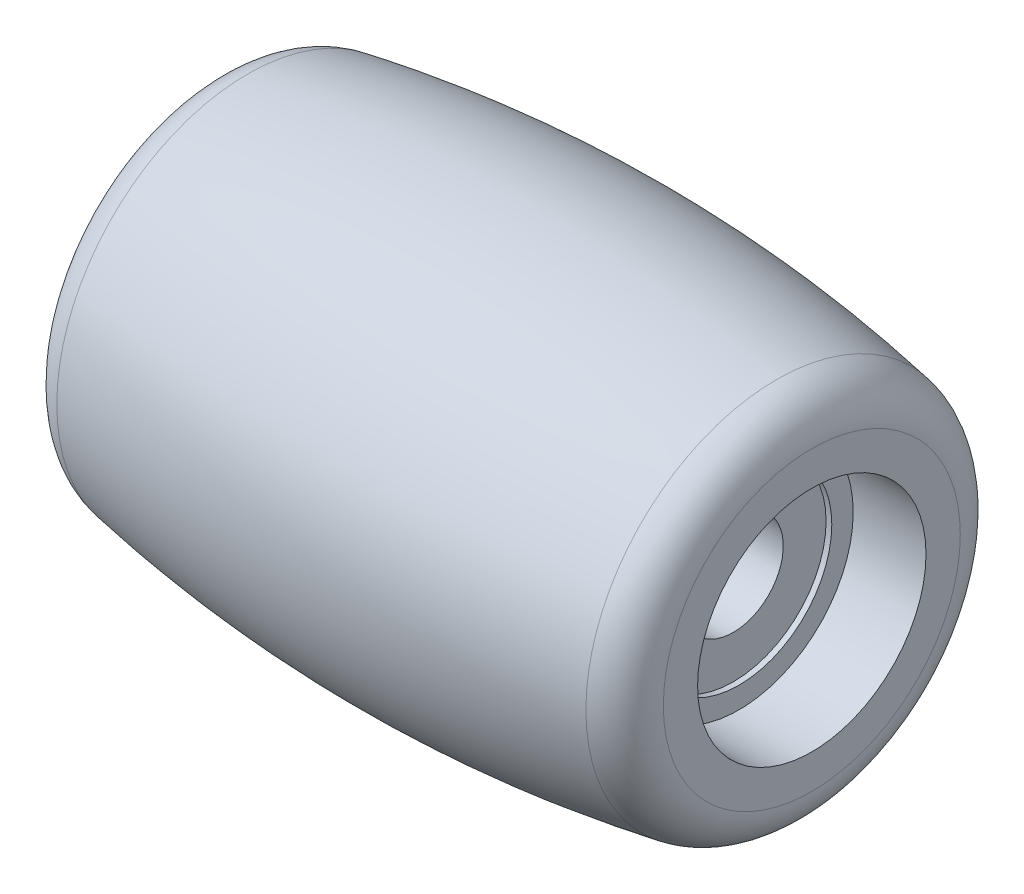
ISO-10303-21;
HEADER;
FILE_DESCRIPTION(('STEP AP214'),'2;1');
FILE_NAME('part.step','',(''),(''),'','','');
FILE_SCHEMA(('AUTOMOTIVE_DESIGN { 1 0 10303 214 1 1 1 1 }'));
ENDSEC;
DATA;
#1=APPLICATION_CONTEXT('core data for automotive mechanical design processes');
#2=APPLICATION_PROTOCOL_DEFINITION('international standard','automotive_design',2000,#1);
#3=PRODUCT_CONTEXT('',#1,'mechanical');
#4=PRODUCT('Part','Part','',(#3));
#5=PRODUCT_RELATED_PRODUCT_CATEGORY('part','',(#4));
#6=PRODUCT_DEFINITION_FORMATION('','',#4);
#7=PRODUCT_DEFINITION_CONTEXT('part definition',#1,'design');
#8=PRODUCT_DEFINITION('design','',#6,#7);
#9=PRODUCT_DEFINITION_SHAPE('','',#8);
#10=(LENGTH_UNIT() NAMED_UNIT(*) SI_UNIT(.MILLI.,.METRE.));
#11=(NAMED_UNIT(*) PLANE_ANGLE_UNIT() SI_UNIT($,.RADIAN.));
#12=(NAMED_UNIT(*) SI_UNIT($,.STERADIAN.) SOLID_ANGLE_UNIT());
#13=UNCERTAINTY_MEASURE_WITH_UNIT(LENGTH_MEASURE(1.E-05),#10,'distance_accuracy_value','');
#14=(GEOMETRIC_REPRESENTATION_CONTEXT(3) GLOBAL_UNCERTAINTY_ASSIGNED_CONTEXT((#13)) GLOBAL_UNIT_ASSIGNED_CONTEXT((#10,
#11,#12)) REPRESENTATION_CONTEXT('',''));
#15=CARTESIAN_POINT('',(0.,0.,0.));
#16=DIRECTION('',(0.,0.,1.));
#17=DIRECTION('',(1.,0.,0.));
#18=AXIS2_PLACEMENT_3D('',#15,#16,#17);
#19=CARTESIAN_POINT('',(15.5,48.5,0.));
#20=DIRECTION('',(-1.,0.,0.));
#21=DIRECTION('',(0.,0.,1.));
#22=AXIS2_PLACEMENT_3D('',#19,#20,#21);
#23=CYLINDRICAL_SURFACE('',#22,3.5);
#24=CARTESIAN_POINT('',(15.5,48.5,0.));
#25=DIRECTION('',(-1.,0.,0.));
#26=DIRECTION('',(0.,0.,1.));
#27=AXIS2_PLACEMENT_3D('',#24,#25,#26);
#28=CIRCLE('',#27,3.5);
#29=CARTESIAN_POINT('',(15.5,48.5,3.5));
#30=VERTEX_POINT('',#29);
#31=EDGE_CURVE('E297',#30,#30,#28,.F.);
#32=ORIENTED_EDGE('',*,*,#31,.T.);
#33=EDGE_LOOP('',(#32));
#34=FACE_BOUND('',#33,.T.);
#35=CARTESIAN_POINT('',(-15.5,48.5,0.));
#36=DIRECTION('',(-1.,0.,0.));
#37=DIRECTION('',(0.,0.,1.));
#38=AXIS2_PLACEMENT_3D('',#35,#36,#37);
#39=CIRCLE('',#38,3.5);
#40=CARTESIAN_POINT('',(-15.5,48.5,3.5));
#41=VERTEX_POINT('',#40);
#42=EDGE_CURVE('E294',#41,#41,#39,.T.);
#43=ORIENTED_EDGE('',*,*,#42,.T.);
#44=EDGE_LOOP('',(#43));
#45=FACE_BOUND('',#44,.T.);
#46=ADVANCED_FACE('F16',(#34,#45),#23,.F.);
#47=CARTESIAN_POINT('',(15.5,41.922,-6.578));
#48=DIRECTION('',(-1.,0.,0.));
#49=DIRECTION('',(0.,0.,1.));
#50=AXIS2_PLACEMENT_3D('',#47,#48,#49);
#51=PLANE('',#50);
#52=CARTESIAN_POINT('',(15.5,48.5,0.));
#53=DIRECTION('',(-1.,0.,0.));
#54=DIRECTION('',(0.,0.,1.));
#55=AXIS2_PLACEMENT_3D('',#52,#53,#54);
#56=CIRCLE('',#55,6.5);
#57=CARTESIAN_POINT('',(15.5,48.5,6.5));
#58=VERTEX_POINT('',#57);
#59=EDGE_CURVE('E292',#58,#58,#56,.F.);
#60=ORIENTED_EDGE('',*,*,#59,.T.);
#61=EDGE_LOOP('',(#60));
#62=FACE_BOUND('',#61,.T.);
#63=ORIENTED_EDGE('',*,*,#31,.F.);
#64=EDGE_LOOP('',(#63));
#65=FACE_BOUND('',#64,.T.);
#66=ADVANCED_FACE('F151',(#62,#65),#51,.F.);
#67=CARTESIAN_POINT('',(-15.5,41.922,6.578));
#68=DIRECTION('',(1.,0.,0.));
#69=DIRECTION('',(0.,0.,-1.));
#70=AXIS2_PLACEMENT_3D('',#67,#68,#69);
#71=PLANE('',#70);
#72=CARTESIAN_POINT('',(-15.5,48.5,0.));
#73=DIRECTION('',(-1.,0.,0.));
#74=DIRECTION('',(0.,0.,1.));
#75=AXIS2_PLACEMENT_3D('',#72,#73,#74);
#76=CIRCLE('',#75,6.5);
#77=CARTESIAN_POINT('',(-15.5,48.5,6.5));
#78=VERTEX_POINT('',#77);
#79=EDGE_CURVE('E289',#78,#78,#76,.T.);
#80=ORIENTED_EDGE('',*,*,#79,.T.);
#81=EDGE_LOOP('',(#80));
#82=FACE_BOUND('',#81,.T.);
#83=ORIENTED_EDGE('',*,*,#42,.F.);
#84=EDGE_LOOP('',(#83));
#85=FACE_BOUND('',#84,.T.);
#86=ADVANCED_FACE('F148',(#82,#85),#71,.F.);
#87=CARTESIAN_POINT('',(15.9,48.5,0.));
#88=DIRECTION('',(-1.,0.,0.));
#89=DIRECTION('',(0.,0.,1.));
#90=AXIS2_PLACEMENT_3D('',#87,#88,#89);
#91=CYLINDRICAL_SURFACE('',#90,6.5);
#92=ORIENTED_EDGE('',*,*,#59,.F.);
#93=EDGE_LOOP('',(#92));
#94=FACE_BOUND('',#93,.T.);
#95=CARTESIAN_POINT('',(15.9,48.5,0.));
#96=DIRECTION('',(-1.,0.,0.));
#97=DIRECTION('',(0.,0.,1.));
#98=AXIS2_PLACEMENT_3D('',#95,#96,#97);
#99=CIRCLE('',#98,6.5);
#100=CARTESIAN_POINT('',(15.9,48.5,6.5));
#101=VERTEX_POINT('',#100);
#102=EDGE_CURVE('E286',#101,#101,#99,.F.);
#103=ORIENTED_EDGE('',*,*,#102,.T.);
#104=EDGE_LOOP('',(#103));
#105=FACE_BOUND('',#104,.T.);
#106=ADVANCED_FACE('F144',(#94,#105),#91,.F.);
#107=CARTESIAN_POINT('',(-15.5,48.5,0.));
#108=DIRECTION('',(-1.,0.,0.));
#109=DIRECTION('',(0.,0.,1.));
#110=AXIS2_PLACEMENT_3D('',#107,#108,#109);
#111=CYLINDRICAL_SURFACE('',#110,6.5);
#112=ORIENTED_EDGE('',*,*,#79,.F.);
#113=EDGE_LOOP('',(#112));
#114=FACE_BOUND('',#113,.T.);
#115=CARTESIAN_POINT('',(-15.9,48.5,0.));
#116=DIRECTION('',(-1.,0.,0.));
#117=DIRECTION('',(0.,0.,1.));
#118=AXIS2_PLACEMENT_3D('',#115,#116,#117);
#119=CIRCLE('',#118,6.5);
#120=CARTESIAN_POINT('',(-15.9,48.5,6.5));
#121=VERTEX_POINT('',#120);
#122=EDGE_CURVE('E283',#121,#121,#119,.T.);
#123=ORIENTED_EDGE('',*,*,#122,.T.);
#124=EDGE_LOOP('',(#123));
#125=FACE_BOUND('',#124,.T.);
#126=ADVANCED_FACE('F140',(#114,#125),#111,.F.);
#127=CARTESIAN_POINT('',(15.9,40.404,-8.096));
#128=DIRECTION('',(-1.,0.,0.));
#129=DIRECTION('',(0.,0.,1.));
#130=AXIS2_PLACEMENT_3D('',#127,#128,#129);
#131=PLANE('',#130);
#132=CARTESIAN_POINT('',(15.9,48.5,0.));
#133=DIRECTION('',(-1.,0.,0.));
#134=DIRECTION('',(0.,0.,1.));
#135=AXIS2_PLACEMENT_3D('',#132,#133,#134);
#136=CIRCLE('',#135,8.);
#137=CARTESIAN_POINT('',(15.9,48.5,8.));
#138=VERTEX_POINT('',#137);
#139=EDGE_CURVE('E278',#138,#138,#136,.F.);
#140=ORIENTED_EDGE('',*,*,#139,.T.);
#141=EDGE_LOOP('',(#140));
#142=FACE_BOUND('',#141,.T.);
#143=ORIENTED_EDGE('',*,*,#102,.F.);
#144=EDGE_LOOP('',(#143));
#145=FACE_BOUND('',#144,.T.);
#146=ADVANCED_FACE('F136',(#142,#145),#131,.F.);
#147=CARTESIAN_POINT('',(-15.9,40.404,8.096));
#148=DIRECTION('',(1.,0.,0.));
#149=DIRECTION('',(0.,0.,-1.));
#150=AXIS2_PLACEMENT_3D('',#147,#148,#149);
#151=PLANE('',#150);
#152=CARTESIAN_POINT('',(-15.9,48.5,0.));
#153=DIRECTION('',(-1.,0.,0.));
#154=DIRECTION('',(0.,0.,1.));
#155=AXIS2_PLACEMENT_3D('',#152,#153,#154);
#156=CIRCLE('',#155,8.);
#157=CARTESIAN_POINT('',(-15.9,48.5,8.));
#158=VERTEX_POINT('',#157);
#159=EDGE_CURVE('E274',#158,#158,#156,.T.);
#160=ORIENTED_EDGE('',*,*,#159,.T.);
#161=EDGE_LOOP('',(#160));
#162=FACE_BOUND('',#161,.T.);
#163=ORIENTED_EDGE('',*,*,#122,.F.);
#164=EDGE_LOOP('',(#163));
#165=FACE_BOUND('',#164,.T.);
#166=ADVANCED_FACE('F132',(#162,#165),#151,.F.);
#167=CARTESIAN_POINT('',(21.,48.5,0.));
#168=DIRECTION('',(-1.,0.,0.));
#169=DIRECTION('',(0.,0.,1.));
#170=AXIS2_PLACEMENT_3D('',#167,#168,#169);
#171=CYLINDRICAL_SURFACE('',#170,8.);
#172=ORIENTED_EDGE('',*,*,#139,.F.);
#173=EDGE_LOOP('',(#172));
#174=FACE_BOUND('',#173,.T.);
#175=CARTESIAN_POINT('',(21.,48.5,0.));
#176=DIRECTION('',(-1.,0.,0.));
#177=DIRECTION('',(0.,0.,1.));
#178=AXIS2_PLACEMENT_3D('',#175,#176,#177);
#179=CIRCLE('',#178,8.);
#180=CARTESIAN_POINT('',(21.,48.5,8.));
#181=VERTEX_POINT('',#180);
#182=EDGE_CURVE('E272',#181,#181,#179,.F.);
#183=ORIENTED_EDGE('',*,*,#182,.T.);
#184=EDGE_LOOP('',(#183));
#185=FACE_BOUND('',#184,.T.);
#186=ADVANCED_FACE('F128',(#174,#185),#171,.F.);
#187=CARTESIAN_POINT('',(-15.9,48.5,0.));
#188=DIRECTION('',(-1.,0.,0.));
#189=DIRECTION('',(0.,0.,1.));
#190=AXIS2_PLACEMENT_3D('',#187,#188,#189);
#191=CYLINDRICAL_SURFACE('',#190,8.);
#192=ORIENTED_EDGE('',*,*,#159,.F.);
#193=EDGE_LOOP('',(#192));
#194=FACE_BOUND('',#193,.T.);
#195=CARTESIAN_POINT('',(-21.,48.5,0.));
#196=DIRECTION('',(-1.,0.,0.));
#197=DIRECTION('',(0.,0.,1.));
#198=AXIS2_PLACEMENT_3D('',#195,#196,#197);
#199=CIRCLE('',#198,8.);
#200=CARTESIAN_POINT('',(-21.,48.5,8.));
#201=VERTEX_POINT('',#200);
#202=EDGE_CURVE('E51',#201,#201,#199,.T.);
#203=ORIENTED_EDGE('',*,*,#202,.T.);
#204=EDGE_LOOP('',(#203));
#205=FACE_BOUND('',#204,.T.);
#206=ADVANCED_FACE('F123',(#194,#205),#191,.F.);
#207=CARTESIAN_POINT('',(21.,37.295757622,-11.204242378));
#208=DIRECTION('',(-1.,0.,0.));
#209=DIRECTION('',(0.,0.,1.));
#210=AXIS2_PLACEMENT_3D('',#207,#208,#209);
#211=PLANE('',#210);
#212=ORIENTED_EDGE('',*,*,#182,.F.);
#213=EDGE_LOOP('',(#212));
#214=FACE_BOUND('',#213,.T.);
#215=CARTESIAN_POINT('',(21.,48.5,0.));
#216=DIRECTION('',(-1.,0.,0.));
#217=DIRECTION('',(0.,0.,1.));
#218=AXIS2_PLACEMENT_3D('',#215,#216,#217);
#219=CIRCLE('',#218,10.4003549674537);
#220=CARTESIAN_POINT('',(21.,48.5,10.4003549674537));
#221=VERTEX_POINT('',#220);
#222=CARTESIAN_POINT('',(21.,48.5,-10.4003549674537));
#223=VERTEX_POINT('',#222);
#224=EDGE_CURVE('E44',#221,#223,#219,.T.);
#225=ORIENTED_EDGE('',*,*,#224,.F.);
#226=CARTESIAN_POINT('',(21.,48.5,0.));
#227=DIRECTION('',(-1.,0.,0.));
#228=DIRECTION('',(0.,0.,-1.));
#229=AXIS2_PLACEMENT_3D('',#226,#227,#228);
#230=CIRCLE('',#229,10.4003549674537);
#231=EDGE_CURVE('E47',#223,#221,#230,.T.);
#232=ORIENTED_EDGE('',*,*,#231,.F.);
#233=EDGE_LOOP('',(#225,#232));
#234=FACE_BOUND('',#233,.T.);
#235=ADVANCED_FACE('F49',(#214,#234),#211,.F.);
#236=CARTESIAN_POINT('',(-21.,37.295757622,11.204242378));
#237=DIRECTION('',(1.,0.,0.));
#238=DIRECTION('',(0.,0.,-1.));
#239=AXIS2_PLACEMENT_3D('',#236,#237,#238);
#240=PLANE('',#239);
#241=ORIENTED_EDGE('',*,*,#202,.F.);
#242=EDGE_LOOP('',(#241));
#243=FACE_BOUND('',#242,.T.);
#244=CARTESIAN_POINT('',(-21.,48.5,0.));
#245=DIRECTION('',(1.,0.,0.));
#246=DIRECTION('',(0.,0.,-1.));
#247=AXIS2_PLACEMENT_3D('',#244,#245,#246);
#248=CIRCLE('',#247,10.4003549674537);
#249=CARTESIAN_POINT('',(-21.,48.5,-10.4003549674537));
#250=VERTEX_POINT('',#249);
#251=CARTESIAN_POINT('',(-21.,48.5,10.4003549674537));
#252=VERTEX_POINT('',#251);
#253=EDGE_CURVE('E56',#250,#252,#248,.T.);
#254=ORIENTED_EDGE('',*,*,#253,.F.);
#255=CARTESIAN_POINT('',(-21.,48.5,0.));
#256=DIRECTION('',(1.,0.,0.));
#257=DIRECTION('',(0.,0.,1.));
#258=AXIS2_PLACEMENT_3D('',#255,#256,#257);
#259=CIRCLE('',#258,10.4003549674537);
#260=EDGE_CURVE('E35',#252,#250,#259,.T.);
#261=ORIENTED_EDGE('',*,*,#260,.F.);
#262=EDGE_LOOP('',(#254,#261));
#263=FACE_BOUND('',#262,.T.);
#264=ADVANCED_FACE('F76',(#243,#263),#240,.F.);
#265=CARTESIAN_POINT('',(18.,48.5,0.));
#266=DIRECTION('',(-1.,0.,0.));
#267=DIRECTION('',(0.,0.,1.));
#268=AXIS2_PLACEMENT_3D('',#265,#266,#267);
#269=TOROIDAL_SURFACE('',#268,10.4003549674537,3.);
#270=CARTESIAN_POINT('',(18.5290368213527,48.5,0.));
#271=DIRECTION('',(-1.,0.,0.));
#272=DIRECTION('',(0.,0.,1.));
#273=AXIS2_PLACEMENT_3D('',#270,#271,#272);
#274=CIRCLE('',#273,13.3533399050471);
#275=CARTESIAN_POINT('',(18.5290368213527,48.5,13.3533399050471));
#276=VERTEX_POINT('',#275);
#277=EDGE_CURVE('E27',#276,#276,#274,.T.);
#278=ORIENTED_EDGE('',*,*,#277,.F.);
#279=EDGE_LOOP('',(#278));
#280=FACE_BOUND('',#279,.T.);
#281=ORIENTED_EDGE('',*,*,#224,.T.);
#282=ORIENTED_EDGE('',*,*,#231,.T.);
#283=EDGE_LOOP('',(#281,#282));
#284=FACE_BOUND('',#283,.T.);
#285=ADVANCED_FACE('F55',(#280,#284),#269,.T.);
#286=CARTESIAN_POINT('',(-18.,48.5,0.));
#287=DIRECTION('',(1.,0.,0.));
#288=DIRECTION('',(0.,0.,-1.));
#289=AXIS2_PLACEMENT_3D('',#286,#287,#288);
#290=TOROIDAL_SURFACE('',#289,10.4003549674537,3.);
#291=CARTESIAN_POINT('',(-18.5290368213527,48.5,0.));
#292=DIRECTION('',(-1.,0.,0.));
#293=DIRECTION('',(0.,0.,1.));
#294=AXIS2_PLACEMENT_3D('',#291,#292,#293);
#295=CIRCLE('',#294,13.3533399050471);
#296=CARTESIAN_POINT('',(-18.5290368213527,48.5,13.3533399050471));
#297=VERTEX_POINT('',#296);
#298=EDGE_CURVE('E11',#297,#297,#295,.F.);
#299=ORIENTED_EDGE('',*,*,#298,.F.);
#300=EDGE_LOOP('',(#299));
#301=FACE_BOUND('',#300,.T.);
#302=ORIENTED_EDGE('',*,*,#253,.T.);
#303=ORIENTED_EDGE('',*,*,#260,.T.);
#304=EDGE_LOOP('',(#302,#303));
#305=FACE_BOUND('',#304,.T.);
#306=ADVANCED_FACE('F75',(#301,#305),#290,.T.);
#307=CARTESIAN_POINT('',(0.,48.5,-90.0722902839116));
#308=DIRECTION('',(0.,1.,0.));
#309=DIRECTION('',(0.,0.,1.));
#310=AXIS2_PLACEMENT_3D('',#307,#308,#309);
#311=CIRCLE('',#310,105.072290283929);
#312=TRIMMED_CURVE('',#311,(PARAMETER_VALUE(-0.540908677335808)),
(PARAMETER_VALUE(0.540908677335807)),.T.,.PARAMETER.);
#313=CARTESIAN_POINT('',(0.,48.5,0.));
#314=DIRECTION('',(-1.,0.,0.));
#315=AXIS1_PLACEMENT('',#313,#314);
#316=SURFACE_OF_REVOLUTION('',#312,#315);
#317=ORIENTED_EDGE('',*,*,#298,.T.);
#318=EDGE_LOOP('',(#317));
#319=FACE_BOUND('',#318,.T.);
#320=ORIENTED_EDGE('',*,*,#277,.T.);
#321=EDGE_LOOP('',(#320));
#322=FACE_BOUND('',#321,.T.);
#323=ADVANCED_FACE('F162',(#319,#322),#316,.F.);
#324=CLOSED_SHELL('',(#46,#66,#86,#106,#126,#146,#166,#186,#206,#235,#264,#285,#306,#323));
#325=MANIFOLD_SOLID_BREP('B1',#324);
#326=ADVANCED_BREP_SHAPE_REPRESENTATION('',(#18,#325),#14);
#327=SHAPE_DEFINITION_REPRESENTATION(#9,#326);
ENDSEC;
END-ISO-10303-21;
